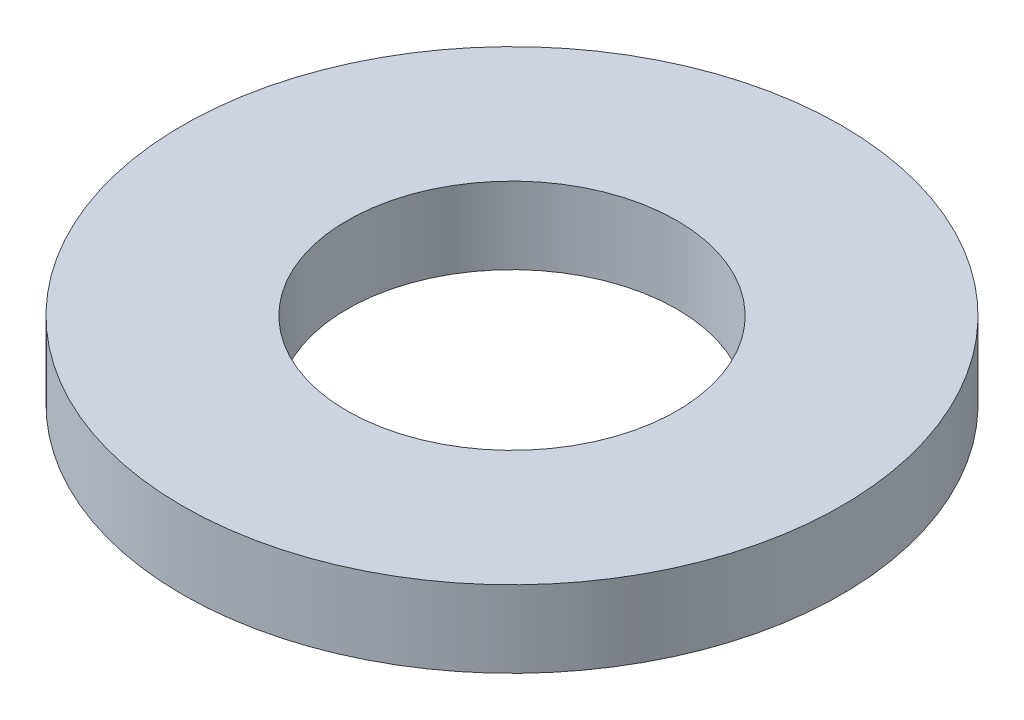
ISO-10303-21;
HEADER;
FILE_DESCRIPTION(('STEP AP214'),'2;1');
FILE_NAME('part.step','',(''),(''),'','','');
FILE_SCHEMA(('AUTOMOTIVE_DESIGN { 1 0 10303 214 1 1 1 1 }'));
ENDSEC;
DATA;
#1=APPLICATION_CONTEXT('core data for automotive mechanical design processes');
#2=APPLICATION_PROTOCOL_DEFINITION('international standard','automotive_design',2000,#1);
#3=PRODUCT_CONTEXT('',#1,'mechanical');
#4=PRODUCT('Part','Part','',(#3));
#5=PRODUCT_RELATED_PRODUCT_CATEGORY('part','',(#4));
#6=PRODUCT_DEFINITION_FORMATION('','',#4);
#7=PRODUCT_DEFINITION_CONTEXT('part definition',#1,'design');
#8=PRODUCT_DEFINITION('design','',#6,#7);
#9=PRODUCT_DEFINITION_SHAPE('','',#8);
#10=(LENGTH_UNIT() NAMED_UNIT(*) SI_UNIT(.MILLI.,.METRE.));
#11=(NAMED_UNIT(*) PLANE_ANGLE_UNIT() SI_UNIT($,.RADIAN.));
#12=(NAMED_UNIT(*) SI_UNIT($,.STERADIAN.) SOLID_ANGLE_UNIT());
#13=UNCERTAINTY_MEASURE_WITH_UNIT(LENGTH_MEASURE(1.E-05),#10,'distance_accuracy_value','');
#14=(GEOMETRIC_REPRESENTATION_CONTEXT(3) GLOBAL_UNCERTAINTY_ASSIGNED_CONTEXT((#13)) GLOBAL_UNIT_ASSIGNED_CONTEXT((#10,
#11,#12)) REPRESENTATION_CONTEXT('',''));
#15=CARTESIAN_POINT('',(0.,0.,0.));
#16=DIRECTION('',(0.,0.,1.));
#17=DIRECTION('',(1.,0.,0.));
#18=AXIS2_PLACEMENT_3D('',#15,#16,#17);
#19=CARTESIAN_POINT('',(0.,2.032,0.));
#20=DIRECTION('',(0.,-1.,0.));
#21=DIRECTION('',(0.,0.,-1.));
#22=AXIS2_PLACEMENT_3D('',#19,#20,#21);
#23=CYLINDRICAL_SURFACE('',#22,8.73125);
#24=CARTESIAN_POINT('',(0.,2.032,0.));
#25=DIRECTION('',(0.,1.,0.));
#26=DIRECTION('',(0.,0.,1.));
#27=AXIS2_PLACEMENT_3D('',#24,#25,#26);
#28=CIRCLE('',#27,8.73125);
#29=CARTESIAN_POINT('',(0.,2.032,8.73125));
#30=VERTEX_POINT('',#29);
#31=EDGE_CURVE('E10',#30,#30,#28,.T.);
#32=ORIENTED_EDGE('',*,*,#31,.F.);
#33=EDGE_LOOP('',(#32));
#34=FACE_BOUND('',#33,.T.);
#35=CARTESIAN_POINT('',(0.,0.,0.));
#36=DIRECTION('',(0.,1.,0.));
#37=DIRECTION('',(0.,0.,1.));
#38=AXIS2_PLACEMENT_3D('',#35,#36,#37);
#39=CIRCLE('',#38,8.73125);
#40=CARTESIAN_POINT('',(0.,0.,8.73125));
#41=VERTEX_POINT('',#40);
#42=EDGE_CURVE('E31',#41,#41,#39,.T.);
#43=ORIENTED_EDGE('',*,*,#42,.T.);
#44=EDGE_LOOP('',(#43));
#45=FACE_BOUND('',#44,.T.);
#46=ADVANCED_FACE('F28',(#34,#45),#23,.T.);
#47=CARTESIAN_POINT('',(0.,2.032,0.));
#48=DIRECTION('',(0.,1.,0.));
#49=DIRECTION('',(0.,0.,1.));
#50=AXIS2_PLACEMENT_3D('',#47,#48,#49);
#51=PLANE('',#50);
#52=CARTESIAN_POINT('',(0.,2.032,0.));
#53=DIRECTION('',(0.,1.,0.));
#54=DIRECTION('',(0.,0.,1.));
#55=AXIS2_PLACEMENT_3D('',#52,#53,#54);
#56=CIRCLE('',#55,4.3688);
#57=CARTESIAN_POINT('',(0.,2.032,4.3688));
#58=VERTEX_POINT('',#57);
#59=EDGE_CURVE('E40',#58,#58,#56,.T.);
#60=ORIENTED_EDGE('',*,*,#59,.F.);
#61=EDGE_LOOP('',(#60));
#62=FACE_BOUND('',#61,.T.);
#63=ORIENTED_EDGE('',*,*,#31,.T.);
#64=EDGE_LOOP('',(#63));
#65=FACE_BOUND('',#64,.T.);
#66=ADVANCED_FACE('F55',(#62,#65),#51,.T.);
#67=CARTESIAN_POINT('',(0.,0.,0.));
#68=DIRECTION('',(0.,1.,0.));
#69=DIRECTION('',(0.,0.,1.));
#70=AXIS2_PLACEMENT_3D('',#67,#68,#69);
#71=PLANE('',#70);
#72=CARTESIAN_POINT('',(0.,0.,0.));
#73=DIRECTION('',(0.,1.,0.));
#74=DIRECTION('',(0.,0.,1.));
#75=AXIS2_PLACEMENT_3D('',#72,#73,#74);
#76=CIRCLE('',#75,4.3688);
#77=CARTESIAN_POINT('',(0.,0.,4.3688));
#78=VERTEX_POINT('',#77);
#79=EDGE_CURVE('E38',#78,#78,#76,.T.);
#80=ORIENTED_EDGE('',*,*,#79,.T.);
#81=EDGE_LOOP('',(#80));
#82=FACE_BOUND('',#81,.T.);
#83=ORIENTED_EDGE('',*,*,#42,.F.);
#84=EDGE_LOOP('',(#83));
#85=FACE_BOUND('',#84,.T.);
#86=ADVANCED_FACE('F46',(#82,#85),#71,.F.);
#87=CARTESIAN_POINT('',(0.,0.,0.));
#88=DIRECTION('',(0.,1.,0.));
#89=DIRECTION('',(0.,0.,1.));
#90=AXIS2_PLACEMENT_3D('',#87,#88,#89);
#91=CYLINDRICAL_SURFACE('',#90,4.3688);
#92=ORIENTED_EDGE('',*,*,#79,.F.);
#93=EDGE_LOOP('',(#92));
#94=FACE_BOUND('',#93,.T.);
#95=ORIENTED_EDGE('',*,*,#59,.T.);
#96=EDGE_LOOP('',(#95));
#97=FACE_BOUND('',#96,.T.);
#98=ADVANCED_FACE('F49',(#94,#97),#91,.F.);
#99=CLOSED_SHELL('',(#46,#66,#86,#98));
#100=MANIFOLD_SOLID_BREP('B2',#99);
#101=ADVANCED_BREP_SHAPE_REPRESENTATION('',(#18,#100),#14);
#102=SHAPE_DEFINITION_REPRESENTATION(#9,#101);
ENDSEC;
END-ISO-10303-21;
